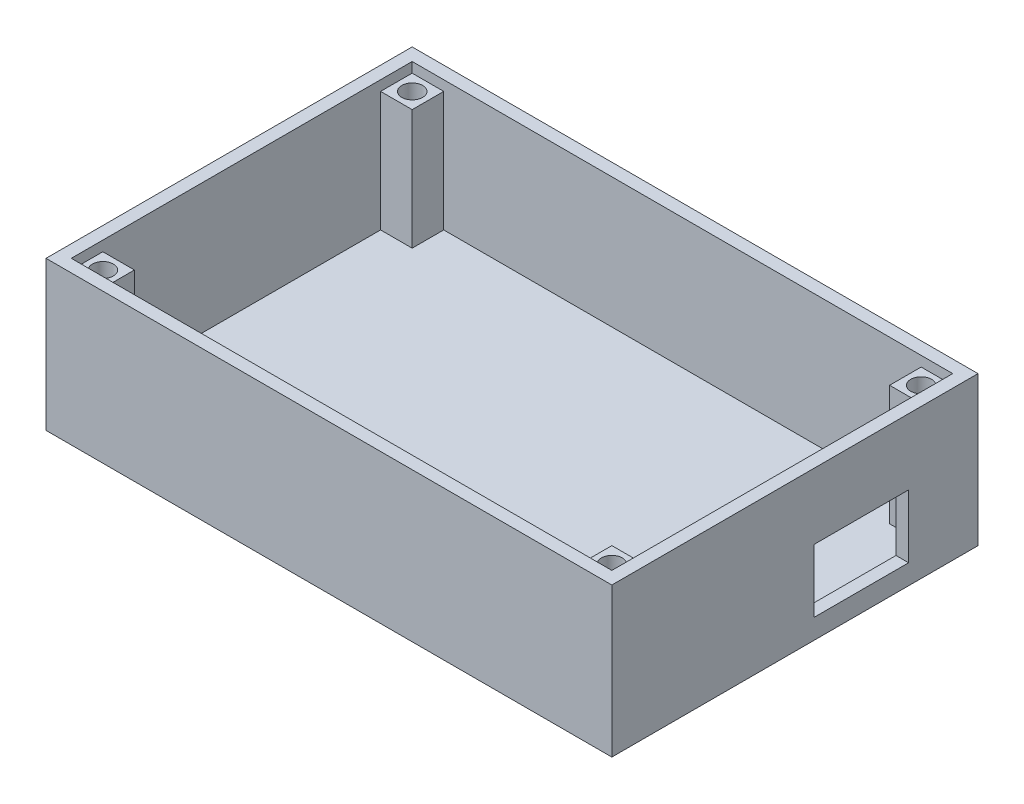
ISO-10303-21;
HEADER;
FILE_DESCRIPTION(('STEP AP214'),'2;1');
FILE_NAME('part.step','',(''),(''),'','','');
FILE_SCHEMA(('AUTOMOTIVE_DESIGN { 1 0 10303 214 1 1 1 1 }'));
ENDSEC;
DATA;
#1=APPLICATION_CONTEXT('core data for automotive mechanical design processes');
#2=APPLICATION_PROTOCOL_DEFINITION('international standard','automotive_design',2000,#1);
#3=PRODUCT_CONTEXT('',#1,'mechanical');
#4=PRODUCT('Part','Part','',(#3));
#5=PRODUCT_RELATED_PRODUCT_CATEGORY('part','',(#4));
#6=PRODUCT_DEFINITION_FORMATION('','',#4);
#7=PRODUCT_DEFINITION_CONTEXT('part definition',#1,'design');
#8=PRODUCT_DEFINITION('design','',#6,#7);
#9=PRODUCT_DEFINITION_SHAPE('','',#8);
#10=(LENGTH_UNIT() NAMED_UNIT(*) SI_UNIT(.MILLI.,.METRE.));
#11=(NAMED_UNIT(*) PLANE_ANGLE_UNIT() SI_UNIT($,.RADIAN.));
#12=(NAMED_UNIT(*) SI_UNIT($,.STERADIAN.) SOLID_ANGLE_UNIT());
#13=UNCERTAINTY_MEASURE_WITH_UNIT(LENGTH_MEASURE(1.E-05),#10,'distance_accuracy_value','');
#14=(GEOMETRIC_REPRESENTATION_CONTEXT(3) GLOBAL_UNCERTAINTY_ASSIGNED_CONTEXT((#13)) GLOBAL_UNIT_ASSIGNED_CONTEXT((#10,
#11,#12)) REPRESENTATION_CONTEXT('',''));
#15=CARTESIAN_POINT('',(0.,0.,0.));
#16=DIRECTION('',(0.,0.,1.));
#17=DIRECTION('',(1.,0.,0.));
#18=AXIS2_PLACEMENT_3D('',#15,#16,#17);
#19=CARTESIAN_POINT('',(42.8,19.,26.99));
#20=DIRECTION('',(-1.,0.,0.));
#21=DIRECTION('',(0.,0.,1.));
#22=AXIS2_PLACEMENT_3D('',#19,#20,#21);
#23=PLANE('',#22);
#24=DIRECTION('',(0.,0.,-1.));
#25=VECTOR('',#24,1.);
#26=CARTESIAN_POINT('',(42.8,0.,26.99));
#27=LINE('',#26,#25);
#28=CARTESIAN_POINT('',(42.8,0.,26.99));
#29=VERTEX_POINT('',#28);
#30=CARTESIAN_POINT('',(42.8,0.,21.99));
#31=VERTEX_POINT('',#30);
#32=EDGE_CURVE('E112',#29,#31,#27,.T.);
#33=ORIENTED_EDGE('',*,*,#32,.T.);
#34=DIRECTION('',(0.,-1.,0.));
#35=VECTOR('',#34,1.);
#36=CARTESIAN_POINT('',(42.8,19.,21.99));
#37=LINE('',#36,#35);
#38=CARTESIAN_POINT('',(42.8,19.,21.99));
#39=VERTEX_POINT('',#38);
#40=EDGE_CURVE('E12',#39,#31,#37,.T.);
#41=ORIENTED_EDGE('',*,*,#40,.F.);
#42=DIRECTION('',(0.,0.,-1.));
#43=VECTOR('',#42,1.);
#44=CARTESIAN_POINT('',(42.8,19.,26.99));
#45=LINE('',#44,#43);
#46=CARTESIAN_POINT('',(42.8,19.,26.99));
#47=VERTEX_POINT('',#46);
#48=EDGE_CURVE('E100',#47,#39,#45,.T.);
#49=ORIENTED_EDGE('',*,*,#48,.F.);
#50=DIRECTION('',(0.,-1.,0.));
#51=VECTOR('',#50,1.);
#52=CARTESIAN_POINT('',(42.8,19.,26.99));
#53=LINE('',#52,#51);
#54=EDGE_CURVE('E108',#47,#29,#53,.T.);
#55=ORIENTED_EDGE('',*,*,#54,.T.);
#56=EDGE_LOOP('',(#33,#41,#49,#55));
#57=FACE_BOUND('',#56,.T.);
#58=ADVANCED_FACE('F49',(#57),#23,.F.);
#59=CARTESIAN_POINT('',(42.8,19.,21.99));
#60=DIRECTION('',(0.,0.,1.));
#61=DIRECTION('',(1.,0.,0.));
#62=AXIS2_PLACEMENT_3D('',#59,#60,#61);
#63=PLANE('',#62);
#64=DIRECTION('',(-1.,0.,0.));
#65=VECTOR('',#64,1.);
#66=CARTESIAN_POINT('',(42.8,0.,21.99));
#67=LINE('',#66,#65);
#68=CARTESIAN_POINT('',(37.8,0.,21.99));
#69=VERTEX_POINT('',#68);
#70=EDGE_CURVE('E104',#31,#69,#67,.T.);
#71=ORIENTED_EDGE('',*,*,#70,.T.);
#72=DIRECTION('',(0.,-1.,0.));
#73=VECTOR('',#72,1.);
#74=CARTESIAN_POINT('',(37.8,19.,21.99));
#75=LINE('',#74,#73);
#76=CARTESIAN_POINT('',(37.8,19.,21.99));
#77=VERTEX_POINT('',#76);
#78=EDGE_CURVE('E57',#77,#69,#75,.T.);
#79=ORIENTED_EDGE('',*,*,#78,.F.);
#80=DIRECTION('',(-1.,0.,0.));
#81=VECTOR('',#80,1.);
#82=CARTESIAN_POINT('',(42.8,19.,21.99));
#83=LINE('',#82,#81);
#84=EDGE_CURVE('E95',#39,#77,#83,.T.);
#85=ORIENTED_EDGE('',*,*,#84,.F.);
#86=ORIENTED_EDGE('',*,*,#40,.T.);
#87=EDGE_LOOP('',(#71,#79,#85,#86));
#88=FACE_BOUND('',#87,.T.);
#89=ADVANCED_FACE('F103',(#88),#63,.F.);
#90=CARTESIAN_POINT('',(37.8,19.,26.99));
#91=DIRECTION('',(1.,0.,0.));
#92=DIRECTION('',(0.,0.,-1.));
#93=AXIS2_PLACEMENT_3D('',#90,#91,#92);
#94=PLANE('',#93);
#95=DIRECTION('',(0.,0.,1.));
#96=VECTOR('',#95,1.);
#97=CARTESIAN_POINT('',(37.8,0.,26.99));
#98=LINE('',#97,#96);
#99=CARTESIAN_POINT('',(37.8,0.,26.99));
#100=VERTEX_POINT('',#99);
#101=EDGE_CURVE('E82',#69,#100,#98,.T.);
#102=ORIENTED_EDGE('',*,*,#101,.T.);
#103=DIRECTION('',(0.,-1.,0.));
#104=VECTOR('',#103,1.);
#105=CARTESIAN_POINT('',(37.8,19.,26.99));
#106=LINE('',#105,#104);
#107=CARTESIAN_POINT('',(37.8,19.,26.99));
#108=VERTEX_POINT('',#107);
#109=EDGE_CURVE('E105',#108,#100,#106,.T.);
#110=ORIENTED_EDGE('',*,*,#109,.F.);
#111=DIRECTION('',(0.,0.,1.));
#112=VECTOR('',#111,1.);
#113=CARTESIAN_POINT('',(37.8,19.,26.99));
#114=LINE('',#113,#112);
#115=EDGE_CURVE('E98',#77,#108,#114,.T.);
#116=ORIENTED_EDGE('',*,*,#115,.F.);
#117=ORIENTED_EDGE('',*,*,#78,.T.);
#118=EDGE_LOOP('',(#102,#110,#116,#117));
#119=FACE_BOUND('',#118,.T.);
#120=ADVANCED_FACE('F106',(#119),#94,.F.);
#121=CARTESIAN_POINT('',(42.8,19.,26.99));
#122=DIRECTION('',(0.,0.,-1.));
#123=DIRECTION('',(-1.,0.,0.));
#124=AXIS2_PLACEMENT_3D('',#121,#122,#123);
#125=PLANE('',#124);
#126=DIRECTION('',(1.,0.,0.));
#127=VECTOR('',#126,1.);
#128=CARTESIAN_POINT('',(42.8,0.,26.99));
#129=LINE('',#128,#127);
#130=EDGE_CURVE('E88',#100,#29,#129,.T.);
#131=ORIENTED_EDGE('',*,*,#130,.T.);
#132=ORIENTED_EDGE('',*,*,#54,.F.);
#133=DIRECTION('',(1.,0.,0.));
#134=VECTOR('',#133,1.);
#135=CARTESIAN_POINT('',(42.8,19.,26.99));
#136=LINE('',#135,#134);
#137=EDGE_CURVE('E65',#108,#47,#136,.T.);
#138=ORIENTED_EDGE('',*,*,#137,.F.);
#139=ORIENTED_EDGE('',*,*,#109,.T.);
#140=EDGE_LOOP('',(#131,#132,#138,#139));
#141=FACE_BOUND('',#140,.T.);
#142=ADVANCED_FACE('F120',(#141),#125,.F.);
#143=CARTESIAN_POINT('',(0.,19.,0.));
#144=DIRECTION('',(0.,1.,0.));
#145=DIRECTION('',(0.,0.,1.));
#146=AXIS2_PLACEMENT_3D('',#143,#144,#145);
#147=PLANE('',#146);
#148=CARTESIAN_POINT('',(40.29900386,19.,24.49509047));
#149=DIRECTION('',(0.,1.,0.));
#150=DIRECTION('',(0.,0.,1.));
#151=AXIS2_PLACEMENT_3D('',#148,#149,#150);
#152=CIRCLE('',#151,1.65);
#153=CARTESIAN_POINT('',(40.29900386,19.,26.14509047));
#154=VERTEX_POINT('',#153);
#155=EDGE_CURVE('E115',#154,#154,#152,.T.);
#156=ORIENTED_EDGE('',*,*,#155,.F.);
#157=EDGE_LOOP('',(#156));
#158=FACE_BOUND('',#157,.T.);
#159=ORIENTED_EDGE('',*,*,#48,.T.);
#160=ORIENTED_EDGE('',*,*,#84,.T.);
#161=ORIENTED_EDGE('',*,*,#115,.T.);
#162=ORIENTED_EDGE('',*,*,#137,.T.);
#163=EDGE_LOOP('',(#159,#160,#161,#162));
#164=FACE_BOUND('',#163,.T.);
#165=ADVANCED_FACE('F96',(#158,#164),#147,.T.);
#166=CARTESIAN_POINT('',(0.,0.,0.));
#167=DIRECTION('',(0.,1.,0.));
#168=DIRECTION('',(0.,0.,1.));
#169=AXIS2_PLACEMENT_3D('',#166,#167,#168);
#170=PLANE('',#169);
#171=ORIENTED_EDGE('',*,*,#32,.F.);
#172=ORIENTED_EDGE('',*,*,#130,.F.);
#173=ORIENTED_EDGE('',*,*,#101,.F.);
#174=ORIENTED_EDGE('',*,*,#70,.F.);
#175=EDGE_LOOP('',(#171,#172,#173,#174));
#176=FACE_BOUND('',#175,.T.);
#177=ADVANCED_FACE('F123',(#176),#170,.F.);
#178=CARTESIAN_POINT('',(40.29900386,15.,24.49509047));
#179=DIRECTION('',(0.,1.,0.));
#180=DIRECTION('',(0.,0.,1.));
#181=AXIS2_PLACEMENT_3D('',#178,#179,#180);
#182=CYLINDRICAL_SURFACE('',#181,1.65);
#183=CARTESIAN_POINT('',(40.29900386,15.,24.49509047));
#184=DIRECTION('',(0.,1.,0.));
#185=DIRECTION('',(0.,0.,1.));
#186=AXIS2_PLACEMENT_3D('',#183,#184,#185);
#187=CIRCLE('',#186,1.65);
#188=CARTESIAN_POINT('',(40.29900386,15.,26.14509047));
#189=VERTEX_POINT('',#188);
#190=EDGE_CURVE('E126',#189,#189,#187,.T.);
#191=ORIENTED_EDGE('',*,*,#190,.F.);
#192=EDGE_LOOP('',(#191));
#193=FACE_BOUND('',#192,.T.);
#194=ORIENTED_EDGE('',*,*,#155,.T.);
#195=EDGE_LOOP('',(#194));
#196=FACE_BOUND('',#195,.T.);
#197=ADVANCED_FACE('F132',(#193,#196),#182,.F.);
#198=CARTESIAN_POINT('',(40.29900386,15.,24.49509047));
#199=DIRECTION('',(0.,1.,0.));
#200=DIRECTION('',(0.,0.,1.));
#201=AXIS2_PLACEMENT_3D('',#198,#199,#200);
#202=PLANE('',#201);
#203=ORIENTED_EDGE('',*,*,#190,.T.);
#204=EDGE_LOOP('',(#203));
#205=FACE_BOUND('',#204,.T.);
#206=ADVANCED_FACE('F176',(#205),#202,.T.);
#207=CLOSED_SHELL('',(#58,#89,#120,#142,#165,#177,#197,#206));
#208=MANIFOLD_SOLID_BREP('B2',#207);
#209=CARTESIAN_POINT('',(-42.8,19.,26.99));
#210=DIRECTION('',(1.,0.,0.));
#211=DIRECTION('',(0.,0.,-1.));
#212=AXIS2_PLACEMENT_3D('',#209,#210,#211);
#213=PLANE('',#212);
#214=DIRECTION('',(0.,0.,1.));
#215=VECTOR('',#214,1.);
#216=CARTESIAN_POINT('',(-42.8,0.,26.99));
#217=LINE('',#216,#215);
#218=CARTESIAN_POINT('',(-42.8,0.,21.99));
#219=VERTEX_POINT('',#218);
#220=CARTESIAN_POINT('',(-42.8,0.,26.99));
#221=VERTEX_POINT('',#220);
#222=EDGE_CURVE('E275',#219,#221,#217,.T.);
#223=ORIENTED_EDGE('',*,*,#222,.T.);
#224=DIRECTION('',(0.,-1.,0.));
#225=VECTOR('',#224,1.);
#226=CARTESIAN_POINT('',(-42.8,19.,26.99));
#227=LINE('',#226,#225);
#228=CARTESIAN_POINT('',(-42.8,19.,26.99));
#229=VERTEX_POINT('',#228);
#230=EDGE_CURVE('E47',#229,#221,#227,.T.);
#231=ORIENTED_EDGE('',*,*,#230,.F.);
#232=DIRECTION('',(0.,0.,1.));
#233=VECTOR('',#232,1.);
#234=CARTESIAN_POINT('',(-42.8,19.,26.99));
#235=LINE('',#234,#233);
#236=CARTESIAN_POINT('',(-42.8,19.,21.99));
#237=VERTEX_POINT('',#236);
#238=EDGE_CURVE('E263',#237,#229,#235,.T.);
#239=ORIENTED_EDGE('',*,*,#238,.F.);
#240=DIRECTION('',(0.,-1.,0.));
#241=VECTOR('',#240,1.);
#242=CARTESIAN_POINT('',(-42.8,19.,21.99));
#243=LINE('',#242,#241);
#244=EDGE_CURVE('E271',#237,#219,#243,.T.);
#245=ORIENTED_EDGE('',*,*,#244,.T.);
#246=EDGE_LOOP('',(#223,#231,#239,#245));
#247=FACE_BOUND('',#246,.T.);
#248=ADVANCED_FACE('F212',(#247),#213,.F.);
#249=CARTESIAN_POINT('',(-42.8,19.,26.99));
#250=DIRECTION('',(0.,0.,-1.));
#251=DIRECTION('',(-1.,0.,0.));
#252=AXIS2_PLACEMENT_3D('',#249,#250,#251);
#253=PLANE('',#252);
#254=DIRECTION('',(1.,0.,0.));
#255=VECTOR('',#254,1.);
#256=CARTESIAN_POINT('',(-42.8,0.,26.99));
#257=LINE('',#256,#255);
#258=CARTESIAN_POINT('',(-37.8,0.,26.99));
#259=VERTEX_POINT('',#258);
#260=EDGE_CURVE('E267',#221,#259,#257,.T.);
#261=ORIENTED_EDGE('',*,*,#260,.T.);
#262=DIRECTION('',(0.,-1.,0.));
#263=VECTOR('',#262,1.);
#264=CARTESIAN_POINT('',(-37.8,19.,26.99));
#265=LINE('',#264,#263);
#266=CARTESIAN_POINT('',(-37.8,19.,26.99));
#267=VERTEX_POINT('',#266);
#268=EDGE_CURVE('E220',#267,#259,#265,.T.);
#269=ORIENTED_EDGE('',*,*,#268,.F.);
#270=DIRECTION('',(1.,0.,0.));
#271=VECTOR('',#270,1.);
#272=CARTESIAN_POINT('',(-42.8,19.,26.99));
#273=LINE('',#272,#271);
#274=EDGE_CURVE('E258',#229,#267,#273,.T.);
#275=ORIENTED_EDGE('',*,*,#274,.F.);
#276=ORIENTED_EDGE('',*,*,#230,.T.);
#277=EDGE_LOOP('',(#261,#269,#275,#276));
#278=FACE_BOUND('',#277,.T.);
#279=ADVANCED_FACE('F266',(#278),#253,.F.);
#280=CARTESIAN_POINT('',(-37.8,19.,26.99));
#281=DIRECTION('',(-1.,0.,0.));
#282=DIRECTION('',(0.,0.,1.));
#283=AXIS2_PLACEMENT_3D('',#280,#281,#282);
#284=PLANE('',#283);
#285=DIRECTION('',(0.,0.,-1.));
#286=VECTOR('',#285,1.);
#287=CARTESIAN_POINT('',(-37.8,0.,26.99));
#288=LINE('',#287,#286);
#289=CARTESIAN_POINT('',(-37.8,0.,21.99));
#290=VERTEX_POINT('',#289);
#291=EDGE_CURVE('E245',#259,#290,#288,.T.);
#292=ORIENTED_EDGE('',*,*,#291,.T.);
#293=DIRECTION('',(0.,-1.,0.));
#294=VECTOR('',#293,1.);
#295=CARTESIAN_POINT('',(-37.8,19.,21.99));
#296=LINE('',#295,#294);
#297=CARTESIAN_POINT('',(-37.8,19.,21.99));
#298=VERTEX_POINT('',#297);
#299=EDGE_CURVE('E268',#298,#290,#296,.T.);
#300=ORIENTED_EDGE('',*,*,#299,.F.);
#301=DIRECTION('',(0.,0.,-1.));
#302=VECTOR('',#301,1.);
#303=CARTESIAN_POINT('',(-37.8,19.,26.99));
#304=LINE('',#303,#302);
#305=EDGE_CURVE('E261',#267,#298,#304,.T.);
#306=ORIENTED_EDGE('',*,*,#305,.F.);
#307=ORIENTED_EDGE('',*,*,#268,.T.);
#308=EDGE_LOOP('',(#292,#300,#306,#307));
#309=FACE_BOUND('',#308,.T.);
#310=ADVANCED_FACE('F269',(#309),#284,.F.);
#311=CARTESIAN_POINT('',(-42.8,19.,21.99));
#312=DIRECTION('',(0.,0.,1.));
#313=DIRECTION('',(1.,0.,0.));
#314=AXIS2_PLACEMENT_3D('',#311,#312,#313);
#315=PLANE('',#314);
#316=DIRECTION('',(-1.,0.,0.));
#317=VECTOR('',#316,1.);
#318=CARTESIAN_POINT('',(-42.8,0.,21.99));
#319=LINE('',#318,#317);
#320=EDGE_CURVE('E251',#290,#219,#319,.T.);
#321=ORIENTED_EDGE('',*,*,#320,.T.);
#322=ORIENTED_EDGE('',*,*,#244,.F.);
#323=DIRECTION('',(-1.,0.,0.));
#324=VECTOR('',#323,1.);
#325=CARTESIAN_POINT('',(-42.8,19.,21.99));
#326=LINE('',#325,#324);
#327=EDGE_CURVE('E228',#298,#237,#326,.T.);
#328=ORIENTED_EDGE('',*,*,#327,.F.);
#329=ORIENTED_EDGE('',*,*,#299,.T.);
#330=EDGE_LOOP('',(#321,#322,#328,#329));
#331=FACE_BOUND('',#330,.T.);
#332=ADVANCED_FACE('F283',(#331),#315,.F.);
#333=CARTESIAN_POINT('',(0.,19.,0.));
#334=DIRECTION('',(0.,-1.,0.));
#335=DIRECTION('',(0.,0.,-1.));
#336=AXIS2_PLACEMENT_3D('',#333,#334,#335);
#337=PLANE('',#336);
#338=CARTESIAN_POINT('',(-40.2908036,19.,24.49509047));
#339=DIRECTION('',(0.,1.,0.));
#340=DIRECTION('',(0.,0.,1.));
#341=AXIS2_PLACEMENT_3D('',#338,#339,#340);
#342=CIRCLE('',#341,1.65);
#343=CARTESIAN_POINT('',(-40.2908036,19.,26.14509047));
#344=VERTEX_POINT('',#343);
#345=EDGE_CURVE('E289',#344,#344,#342,.T.);
#346=ORIENTED_EDGE('',*,*,#345,.F.);
#347=EDGE_LOOP('',(#346));
#348=FACE_BOUND('',#347,.T.);
#349=ORIENTED_EDGE('',*,*,#238,.T.);
#350=ORIENTED_EDGE('',*,*,#274,.T.);
#351=ORIENTED_EDGE('',*,*,#305,.T.);
#352=ORIENTED_EDGE('',*,*,#327,.T.);
#353=EDGE_LOOP('',(#349,#350,#351,#352));
#354=FACE_BOUND('',#353,.T.);
#355=ADVANCED_FACE('F259',(#348,#354),#337,.F.);
#356=CARTESIAN_POINT('',(0.,0.,0.));
#357=DIRECTION('',(0.,-1.,0.));
#358=DIRECTION('',(0.,0.,-1.));
#359=AXIS2_PLACEMENT_3D('',#356,#357,#358);
#360=PLANE('',#359);
#361=ORIENTED_EDGE('',*,*,#222,.F.);
#362=ORIENTED_EDGE('',*,*,#320,.F.);
#363=ORIENTED_EDGE('',*,*,#291,.F.);
#364=ORIENTED_EDGE('',*,*,#260,.F.);
#365=EDGE_LOOP('',(#361,#362,#363,#364));
#366=FACE_BOUND('',#365,.T.);
#367=ADVANCED_FACE('F286',(#366),#360,.T.);
#368=CARTESIAN_POINT('',(-40.2908036,15.,24.49509047));
#369=DIRECTION('',(0.,1.,0.));
#370=DIRECTION('',(0.,0.,1.));
#371=AXIS2_PLACEMENT_3D('',#368,#369,#370);
#372=CYLINDRICAL_SURFACE('',#371,1.65);
#373=CARTESIAN_POINT('',(-40.2908036,15.,24.49509047));
#374=DIRECTION('',(0.,1.,0.));
#375=DIRECTION('',(0.,0.,1.));
#376=AXIS2_PLACEMENT_3D('',#373,#374,#375);
#377=CIRCLE('',#376,1.65);
#378=CARTESIAN_POINT('',(-40.2908036,15.,26.14509047));
#379=VERTEX_POINT('',#378);
#380=EDGE_CURVE('E278',#379,#379,#377,.T.);
#381=ORIENTED_EDGE('',*,*,#380,.F.);
#382=EDGE_LOOP('',(#381));
#383=FACE_BOUND('',#382,.T.);
#384=ORIENTED_EDGE('',*,*,#345,.T.);
#385=EDGE_LOOP('',(#384));
#386=FACE_BOUND('',#385,.T.);
#387=ADVANCED_FACE('F297',(#383,#386),#372,.F.);
#388=CARTESIAN_POINT('',(-40.2908036,15.,24.49509047));
#389=DIRECTION('',(0.,1.,0.));
#390=DIRECTION('',(0.,0.,1.));
#391=AXIS2_PLACEMENT_3D('',#388,#389,#390);
#392=PLANE('',#391);
#393=ORIENTED_EDGE('',*,*,#380,.T.);
#394=EDGE_LOOP('',(#393));
#395=FACE_BOUND('',#394,.T.);
#396=ADVANCED_FACE('F295',(#395),#392,.T.);
#397=CLOSED_SHELL('',(#248,#279,#310,#332,#355,#367,#387,#396));
#398=MANIFOLD_SOLID_BREP('B6',#397);
#399=CARTESIAN_POINT('',(-42.8,19.,-26.99));
#400=DIRECTION('',(1.,0.,0.));
#401=DIRECTION('',(0.,0.,-1.));
#402=AXIS2_PLACEMENT_3D('',#399,#400,#401);
#403=PLANE('',#402);
#404=DIRECTION('',(0.,0.,1.));
#405=VECTOR('',#404,1.);
#406=CARTESIAN_POINT('',(-42.8,0.,-26.99));
#407=LINE('',#406,#405);
#408=CARTESIAN_POINT('',(-42.8,0.,-26.99));
#409=VERTEX_POINT('',#408);
#410=CARTESIAN_POINT('',(-42.8,0.,-21.99));
#411=VERTEX_POINT('',#410);
#412=EDGE_CURVE('E438',#409,#411,#407,.T.);
#413=ORIENTED_EDGE('',*,*,#412,.T.);
#414=DIRECTION('',(0.,-1.,0.));
#415=VECTOR('',#414,1.);
#416=CARTESIAN_POINT('',(-42.8,19.,-21.99));
#417=LINE('',#416,#415);
#418=CARTESIAN_POINT('',(-42.8,19.,-21.99));
#419=VERTEX_POINT('',#418);
#420=EDGE_CURVE('E210',#419,#411,#417,.T.);
#421=ORIENTED_EDGE('',*,*,#420,.F.);
#422=DIRECTION('',(0.,0.,1.));
#423=VECTOR('',#422,1.);
#424=CARTESIAN_POINT('',(-42.8,19.,-26.99));
#425=LINE('',#424,#423);
#426=CARTESIAN_POINT('',(-42.8,19.,-26.99));
#427=VERTEX_POINT('',#426);
#428=EDGE_CURVE('E426',#427,#419,#425,.T.);
#429=ORIENTED_EDGE('',*,*,#428,.F.);
#430=DIRECTION('',(0.,-1.,0.));
#431=VECTOR('',#430,1.);
#432=CARTESIAN_POINT('',(-42.8,19.,-26.99));
#433=LINE('',#432,#431);
#434=EDGE_CURVE('E434',#427,#409,#433,.T.);
#435=ORIENTED_EDGE('',*,*,#434,.T.);
#436=EDGE_LOOP('',(#413,#421,#429,#435));
#437=FACE_BOUND('',#436,.T.);
#438=ADVANCED_FACE('F375',(#437),#403,.F.);
#439=CARTESIAN_POINT('',(-42.8,19.,-21.99));
#440=DIRECTION('',(0.,0.,-1.));
#441=DIRECTION('',(-1.,0.,0.));
#442=AXIS2_PLACEMENT_3D('',#439,#440,#441);
#443=PLANE('',#442);
#444=DIRECTION('',(1.,0.,0.));
#445=VECTOR('',#444,1.);
#446=CARTESIAN_POINT('',(-42.8,0.,-21.99));
#447=LINE('',#446,#445);
#448=CARTESIAN_POINT('',(-37.8,0.,-21.99));
#449=VERTEX_POINT('',#448);
#450=EDGE_CURVE('E430',#411,#449,#447,.T.);
#451=ORIENTED_EDGE('',*,*,#450,.T.);
#452=DIRECTION('',(0.,-1.,0.));
#453=VECTOR('',#452,1.);
#454=CARTESIAN_POINT('',(-37.8,19.,-21.99));
#455=LINE('',#454,#453);
#456=CARTESIAN_POINT('',(-37.8,19.,-21.99));
#457=VERTEX_POINT('',#456);
#458=EDGE_CURVE('E383',#457,#449,#455,.T.);
#459=ORIENTED_EDGE('',*,*,#458,.F.);
#460=DIRECTION('',(1.,0.,0.));
#461=VECTOR('',#460,1.);
#462=CARTESIAN_POINT('',(-42.8,19.,-21.99));
#463=LINE('',#462,#461);
#464=EDGE_CURVE('E421',#419,#457,#463,.T.);
#465=ORIENTED_EDGE('',*,*,#464,.F.);
#466=ORIENTED_EDGE('',*,*,#420,.T.);
#467=EDGE_LOOP('',(#451,#459,#465,#466));
#468=FACE_BOUND('',#467,.T.);
#469=ADVANCED_FACE('F429',(#468),#443,.F.);
#470=CARTESIAN_POINT('',(-37.8,19.,-26.99));
#471=DIRECTION('',(-1.,0.,0.));
#472=DIRECTION('',(0.,0.,1.));
#473=AXIS2_PLACEMENT_3D('',#470,#471,#472);
#474=PLANE('',#473);
#475=DIRECTION('',(0.,0.,-1.));
#476=VECTOR('',#475,1.);
#477=CARTESIAN_POINT('',(-37.8,0.,-26.99));
#478=LINE('',#477,#476);
#479=CARTESIAN_POINT('',(-37.8,0.,-26.99));
#480=VERTEX_POINT('',#479);
#481=EDGE_CURVE('E408',#449,#480,#478,.T.);
#482=ORIENTED_EDGE('',*,*,#481,.T.);
#483=DIRECTION('',(0.,-1.,0.));
#484=VECTOR('',#483,1.);
#485=CARTESIAN_POINT('',(-37.8,19.,-26.99));
#486=LINE('',#485,#484);
#487=CARTESIAN_POINT('',(-37.8,19.,-26.99));
#488=VERTEX_POINT('',#487);
#489=EDGE_CURVE('E431',#488,#480,#486,.T.);
#490=ORIENTED_EDGE('',*,*,#489,.F.);
#491=DIRECTION('',(0.,0.,-1.));
#492=VECTOR('',#491,1.);
#493=CARTESIAN_POINT('',(-37.8,19.,-26.99));
#494=LINE('',#493,#492);
#495=EDGE_CURVE('E424',#457,#488,#494,.T.);
#496=ORIENTED_EDGE('',*,*,#495,.F.);
#497=ORIENTED_EDGE('',*,*,#458,.T.);
#498=EDGE_LOOP('',(#482,#490,#496,#497));
#499=FACE_BOUND('',#498,.T.);
#500=ADVANCED_FACE('F432',(#499),#474,.F.);
#501=CARTESIAN_POINT('',(-42.8,19.,-26.99));
#502=DIRECTION('',(0.,0.,1.));
#503=DIRECTION('',(1.,0.,0.));
#504=AXIS2_PLACEMENT_3D('',#501,#502,#503);
#505=PLANE('',#504);
#506=DIRECTION('',(-1.,0.,0.));
#507=VECTOR('',#506,1.);
#508=CARTESIAN_POINT('',(-42.8,0.,-26.99));
#509=LINE('',#508,#507);
#510=EDGE_CURVE('E414',#480,#409,#509,.T.);
#511=ORIENTED_EDGE('',*,*,#510,.T.);
#512=ORIENTED_EDGE('',*,*,#434,.F.);
#513=DIRECTION('',(-1.,0.,0.));
#514=VECTOR('',#513,1.);
#515=CARTESIAN_POINT('',(-42.8,19.,-26.99));
#516=LINE('',#515,#514);
#517=EDGE_CURVE('E391',#488,#427,#516,.T.);
#518=ORIENTED_EDGE('',*,*,#517,.F.);
#519=ORIENTED_EDGE('',*,*,#489,.T.);
#520=EDGE_LOOP('',(#511,#512,#518,#519));
#521=FACE_BOUND('',#520,.T.);
#522=ADVANCED_FACE('F446',(#521),#505,.F.);
#523=CARTESIAN_POINT('',(0.,19.,0.));
#524=DIRECTION('',(0.,1.,0.));
#525=DIRECTION('',(0.,0.,1.));
#526=AXIS2_PLACEMENT_3D('',#523,#524,#525);
#527=PLANE('',#526);
#528=CARTESIAN_POINT('',(-40.2908036,19.,-24.48916763));
#529=DIRECTION('',(0.,1.,0.));
#530=DIRECTION('',(0.,0.,1.));
#531=AXIS2_PLACEMENT_3D('',#528,#529,#530);
#532=CIRCLE('',#531,1.65);
#533=CARTESIAN_POINT('',(-40.2908036,19.,-22.83916763));
#534=VERTEX_POINT('',#533);
#535=EDGE_CURVE('E441',#534,#534,#532,.T.);
#536=ORIENTED_EDGE('',*,*,#535,.F.);
#537=EDGE_LOOP('',(#536));
#538=FACE_BOUND('',#537,.T.);
#539=ORIENTED_EDGE('',*,*,#428,.T.);
#540=ORIENTED_EDGE('',*,*,#464,.T.);
#541=ORIENTED_EDGE('',*,*,#495,.T.);
#542=ORIENTED_EDGE('',*,*,#517,.T.);
#543=EDGE_LOOP('',(#539,#540,#541,#542));
#544=FACE_BOUND('',#543,.T.);
#545=ADVANCED_FACE('F422',(#538,#544),#527,.T.);
#546=CARTESIAN_POINT('',(0.,0.,0.));
#547=DIRECTION('',(0.,1.,0.));
#548=DIRECTION('',(0.,0.,1.));
#549=AXIS2_PLACEMENT_3D('',#546,#547,#548);
#550=PLANE('',#549);
#551=ORIENTED_EDGE('',*,*,#412,.F.);
#552=ORIENTED_EDGE('',*,*,#510,.F.);
#553=ORIENTED_EDGE('',*,*,#481,.F.);
#554=ORIENTED_EDGE('',*,*,#450,.F.);
#555=EDGE_LOOP('',(#551,#552,#553,#554));
#556=FACE_BOUND('',#555,.T.);
#557=ADVANCED_FACE('F449',(#556),#550,.F.);
#558=CARTESIAN_POINT('',(-40.2908036,15.,-24.48916763));
#559=DIRECTION('',(0.,1.,0.));
#560=DIRECTION('',(0.,0.,1.));
#561=AXIS2_PLACEMENT_3D('',#558,#559,#560);
#562=CYLINDRICAL_SURFACE('',#561,1.65);
#563=CARTESIAN_POINT('',(-40.2908036,15.,-24.48916763));
#564=DIRECTION('',(0.,1.,0.));
#565=DIRECTION('',(0.,0.,1.));
#566=AXIS2_PLACEMENT_3D('',#563,#564,#565);
#567=CIRCLE('',#566,1.65);
#568=CARTESIAN_POINT('',(-40.2908036,15.,-22.83916763));
#569=VERTEX_POINT('',#568);
#570=EDGE_CURVE('E452',#569,#569,#567,.T.);
#571=ORIENTED_EDGE('',*,*,#570,.F.);
#572=EDGE_LOOP('',(#571));
#573=FACE_BOUND('',#572,.T.);
#574=ORIENTED_EDGE('',*,*,#535,.T.);
#575=EDGE_LOOP('',(#574));
#576=FACE_BOUND('',#575,.T.);
#577=ADVANCED_FACE('F458',(#573,#576),#562,.F.);
#578=CARTESIAN_POINT('',(-40.2908036,15.,-24.48916763));
#579=DIRECTION('',(0.,1.,0.));
#580=DIRECTION('',(0.,0.,1.));
#581=AXIS2_PLACEMENT_3D('',#578,#579,#580);
#582=PLANE('',#581);
#583=ORIENTED_EDGE('',*,*,#570,.T.);
#584=EDGE_LOOP('',(#583));
#585=FACE_BOUND('',#584,.T.);
#586=ADVANCED_FACE('F502',(#585),#582,.T.);
#587=CLOSED_SHELL('',(#438,#469,#500,#522,#545,#557,#577,#586));
#588=MANIFOLD_SOLID_BREP('B41',#587);
#589=CARTESIAN_POINT('',(42.8,19.,-26.99));
#590=DIRECTION('',(-1.,0.,0.));
#591=DIRECTION('',(0.,0.,1.));
#592=AXIS2_PLACEMENT_3D('',#589,#590,#591);
#593=PLANE('',#592);
#594=DIRECTION('',(0.,0.,-1.));
#595=VECTOR('',#594,1.);
#596=CARTESIAN_POINT('',(42.8,0.,-26.99));
#597=LINE('',#596,#595);
#598=CARTESIAN_POINT('',(42.8,0.,-21.99));
#599=VERTEX_POINT('',#598);
#600=CARTESIAN_POINT('',(42.8,0.,-26.99));
#601=VERTEX_POINT('',#600);
#602=EDGE_CURVE('E600',#599,#601,#597,.T.);
#603=ORIENTED_EDGE('',*,*,#602,.T.);
#604=DIRECTION('',(0.,-1.,0.));
#605=VECTOR('',#604,1.);
#606=CARTESIAN_POINT('',(42.8,19.,-26.99));
#607=LINE('',#606,#605);
#608=CARTESIAN_POINT('',(42.8,19.,-26.99));
#609=VERTEX_POINT('',#608);
#610=EDGE_CURVE('E373',#609,#601,#607,.T.);
#611=ORIENTED_EDGE('',*,*,#610,.F.);
#612=DIRECTION('',(0.,0.,-1.));
#613=VECTOR('',#612,1.);
#614=CARTESIAN_POINT('',(42.8,19.,-26.99));
#615=LINE('',#614,#613);
#616=CARTESIAN_POINT('',(42.8,19.,-21.99));
#617=VERTEX_POINT('',#616);
#618=EDGE_CURVE('E588',#617,#609,#615,.T.);
#619=ORIENTED_EDGE('',*,*,#618,.F.);
#620=DIRECTION('',(0.,-1.,0.));
#621=VECTOR('',#620,1.);
#622=CARTESIAN_POINT('',(42.8,19.,-21.99));
#623=LINE('',#622,#621);
#624=EDGE_CURVE('E596',#617,#599,#623,.T.);
#625=ORIENTED_EDGE('',*,*,#624,.T.);
#626=EDGE_LOOP('',(#603,#611,#619,#625));
#627=FACE_BOUND('',#626,.T.);
#628=ADVANCED_FACE('F537',(#627),#593,.F.);
#629=CARTESIAN_POINT('',(42.8,19.,-26.99));
#630=DIRECTION('',(0.,0.,1.));
#631=DIRECTION('',(1.,0.,0.));
#632=AXIS2_PLACEMENT_3D('',#629,#630,#631);
#633=PLANE('',#632);
#634=DIRECTION('',(-1.,0.,0.));
#635=VECTOR('',#634,1.);
#636=CARTESIAN_POINT('',(42.8,0.,-26.99));
#637=LINE('',#636,#635);
#638=CARTESIAN_POINT('',(37.8,0.,-26.99));
#639=VERTEX_POINT('',#638);
#640=EDGE_CURVE('E592',#601,#639,#637,.T.);
#641=ORIENTED_EDGE('',*,*,#640,.T.);
#642=DIRECTION('',(0.,-1.,0.));
#643=VECTOR('',#642,1.);
#644=CARTESIAN_POINT('',(37.8,19.,-26.99));
#645=LINE('',#644,#643);
#646=CARTESIAN_POINT('',(37.8,19.,-26.99));
#647=VERTEX_POINT('',#646);
#648=EDGE_CURVE('E545',#647,#639,#645,.T.);
#649=ORIENTED_EDGE('',*,*,#648,.F.);
#650=DIRECTION('',(-1.,0.,0.));
#651=VECTOR('',#650,1.);
#652=CARTESIAN_POINT('',(42.8,19.,-26.99));
#653=LINE('',#652,#651);
#654=EDGE_CURVE('E583',#609,#647,#653,.T.);
#655=ORIENTED_EDGE('',*,*,#654,.F.);
#656=ORIENTED_EDGE('',*,*,#610,.T.);
#657=EDGE_LOOP('',(#641,#649,#655,#656));
#658=FACE_BOUND('',#657,.T.);
#659=ADVANCED_FACE('F591',(#658),#633,.F.);
#660=CARTESIAN_POINT('',(37.8,19.,-26.99));
#661=DIRECTION('',(1.,0.,0.));
#662=DIRECTION('',(0.,0.,-1.));
#663=AXIS2_PLACEMENT_3D('',#660,#661,#662);
#664=PLANE('',#663);
#665=DIRECTION('',(0.,0.,1.));
#666=VECTOR('',#665,1.);
#667=CARTESIAN_POINT('',(37.8,0.,-26.99));
#668=LINE('',#667,#666);
#669=CARTESIAN_POINT('',(37.8,0.,-21.99));
#670=VERTEX_POINT('',#669);
#671=EDGE_CURVE('E570',#639,#670,#668,.T.);
#672=ORIENTED_EDGE('',*,*,#671,.T.);
#673=DIRECTION('',(0.,-1.,0.));
#674=VECTOR('',#673,1.);
#675=CARTESIAN_POINT('',(37.8,19.,-21.99));
#676=LINE('',#675,#674);
#677=CARTESIAN_POINT('',(37.8,19.,-21.99));
#678=VERTEX_POINT('',#677);
#679=EDGE_CURVE('E593',#678,#670,#676,.T.);
#680=ORIENTED_EDGE('',*,*,#679,.F.);
#681=DIRECTION('',(0.,0.,1.));
#682=VECTOR('',#681,1.);
#683=CARTESIAN_POINT('',(37.8,19.,-26.99));
#684=LINE('',#683,#682);
#685=EDGE_CURVE('E586',#647,#678,#684,.T.);
#686=ORIENTED_EDGE('',*,*,#685,.F.);
#687=ORIENTED_EDGE('',*,*,#648,.T.);
#688=EDGE_LOOP('',(#672,#680,#686,#687));
#689=FACE_BOUND('',#688,.T.);
#690=ADVANCED_FACE('F594',(#689),#664,.F.);
#691=CARTESIAN_POINT('',(42.8,19.,-21.99));
#692=DIRECTION('',(0.,0.,-1.));
#693=DIRECTION('',(-1.,0.,0.));
#694=AXIS2_PLACEMENT_3D('',#691,#692,#693);
#695=PLANE('',#694);
#696=DIRECTION('',(1.,0.,0.));
#697=VECTOR('',#696,1.);
#698=CARTESIAN_POINT('',(42.8,0.,-21.99));
#699=LINE('',#698,#697);
#700=EDGE_CURVE('E576',#670,#599,#699,.T.);
#701=ORIENTED_EDGE('',*,*,#700,.T.);
#702=ORIENTED_EDGE('',*,*,#624,.F.);
#703=DIRECTION('',(1.,0.,0.));
#704=VECTOR('',#703,1.);
#705=CARTESIAN_POINT('',(42.8,19.,-21.99));
#706=LINE('',#705,#704);
#707=EDGE_CURVE('E553',#678,#617,#706,.T.);
#708=ORIENTED_EDGE('',*,*,#707,.F.);
#709=ORIENTED_EDGE('',*,*,#679,.T.);
#710=EDGE_LOOP('',(#701,#702,#708,#709));
#711=FACE_BOUND('',#710,.T.);
#712=ADVANCED_FACE('F608',(#711),#695,.F.);
#713=CARTESIAN_POINT('',(0.,19.,0.));
#714=DIRECTION('',(0.,-1.,0.));
#715=DIRECTION('',(0.,0.,-1.));
#716=AXIS2_PLACEMENT_3D('',#713,#714,#715);
#717=PLANE('',#716);
#718=CARTESIAN_POINT('',(40.29900386,19.,-24.49016763));
#719=DIRECTION('',(0.,1.,0.));
#720=DIRECTION('',(0.,0.,1.));
#721=AXIS2_PLACEMENT_3D('',#718,#719,#720);
#722=CIRCLE('',#721,1.65);
#723=CARTESIAN_POINT('',(40.29900386,19.,-22.84016763));
#724=VERTEX_POINT('',#723);
#725=EDGE_CURVE('E603',#724,#724,#722,.T.);
#726=ORIENTED_EDGE('',*,*,#725,.F.);
#727=EDGE_LOOP('',(#726));
#728=FACE_BOUND('',#727,.T.);
#729=ORIENTED_EDGE('',*,*,#618,.T.);
#730=ORIENTED_EDGE('',*,*,#654,.T.);
#731=ORIENTED_EDGE('',*,*,#685,.T.);
#732=ORIENTED_EDGE('',*,*,#707,.T.);
#733=EDGE_LOOP('',(#729,#730,#731,#732));
#734=FACE_BOUND('',#733,.T.);
#735=ADVANCED_FACE('F584',(#728,#734),#717,.F.);
#736=CARTESIAN_POINT('',(0.,0.,0.));
#737=DIRECTION('',(0.,-1.,0.));
#738=DIRECTION('',(0.,0.,-1.));
#739=AXIS2_PLACEMENT_3D('',#736,#737,#738);
#740=PLANE('',#739);
#741=ORIENTED_EDGE('',*,*,#602,.F.);
#742=ORIENTED_EDGE('',*,*,#700,.F.);
#743=ORIENTED_EDGE('',*,*,#671,.F.);
#744=ORIENTED_EDGE('',*,*,#640,.F.);
#745=EDGE_LOOP('',(#741,#742,#743,#744));
#746=FACE_BOUND('',#745,.T.);
#747=ADVANCED_FACE('F611',(#746),#740,.T.);
#748=CARTESIAN_POINT('',(40.29900386,15.,-24.49016763));
#749=DIRECTION('',(0.,1.,0.));
#750=DIRECTION('',(0.,0.,1.));
#751=AXIS2_PLACEMENT_3D('',#748,#749,#750);
#752=CYLINDRICAL_SURFACE('',#751,1.65);
#753=CARTESIAN_POINT('',(40.29900386,15.,-24.49016763));
#754=DIRECTION('',(0.,1.,0.));
#755=DIRECTION('',(0.,0.,1.));
#756=AXIS2_PLACEMENT_3D('',#753,#754,#755);
#757=CIRCLE('',#756,1.65);
#758=CARTESIAN_POINT('',(40.29900386,15.,-22.84016763));
#759=VERTEX_POINT('',#758);
#760=EDGE_CURVE('E614',#759,#759,#757,.T.);
#761=ORIENTED_EDGE('',*,*,#760,.F.);
#762=EDGE_LOOP('',(#761));
#763=FACE_BOUND('',#762,.T.);
#764=ORIENTED_EDGE('',*,*,#725,.T.);
#765=EDGE_LOOP('',(#764));
#766=FACE_BOUND('',#765,.T.);
#767=ADVANCED_FACE('F620',(#763,#766),#752,.F.);
#768=CARTESIAN_POINT('',(40.29900386,15.,-24.49016763));
#769=DIRECTION('',(0.,1.,0.));
#770=DIRECTION('',(0.,0.,1.));
#771=AXIS2_PLACEMENT_3D('',#768,#769,#770);
#772=PLANE('',#771);
#773=ORIENTED_EDGE('',*,*,#760,.T.);
#774=EDGE_LOOP('',(#773));
#775=FACE_BOUND('',#774,.T.);
#776=ADVANCED_FACE('F664',(#775),#772,.T.);
#777=CLOSED_SHELL('',(#628,#659,#690,#712,#735,#747,#767,#776));
#778=MANIFOLD_SOLID_BREP('B204',#777);
#779=CARTESIAN_POINT('',(0.,20.6,0.));
#780=DIRECTION('',(0.,-1.,0.));
#781=DIRECTION('',(0.,0.,-1.));
#782=AXIS2_PLACEMENT_3D('',#779,#780,#781);
#783=PLANE('',#782);
#784=DIRECTION('',(0.,0.,-1.));
#785=VECTOR('',#784,1.);
#786=CARTESIAN_POINT('',(44.8,20.6,28.99));
#787=LINE('',#786,#785);
#788=CARTESIAN_POINT('',(44.8,20.6,28.99));
#789=VERTEX_POINT('',#788);
#790=CARTESIAN_POINT('',(44.8,20.6,-28.99));
#791=VERTEX_POINT('',#790);
#792=EDGE_CURVE('E849',#789,#791,#787,.T.);
#793=ORIENTED_EDGE('',*,*,#792,.T.);
#794=DIRECTION('',(-1.,0.,0.));
#795=VECTOR('',#794,1.);
#796=CARTESIAN_POINT('',(-44.8,20.6,-28.99));
#797=LINE('',#796,#795);
#798=CARTESIAN_POINT('',(-44.8,20.6,-28.99));
#799=VERTEX_POINT('',#798);
#800=EDGE_CURVE('E852',#791,#799,#797,.T.);
#801=ORIENTED_EDGE('',*,*,#800,.T.);
#802=DIRECTION('',(0.,0.,1.));
#803=VECTOR('',#802,1.);
#804=CARTESIAN_POINT('',(-44.8,20.6,28.99));
#805=LINE('',#804,#803);
#806=CARTESIAN_POINT('',(-44.8,20.6,28.99));
#807=VERTEX_POINT('',#806);
#808=EDGE_CURVE('E854',#799,#807,#805,.T.);
#809=ORIENTED_EDGE('',*,*,#808,.T.);
#810=DIRECTION('',(1.,0.,0.));
#811=VECTOR('',#810,1.);
#812=CARTESIAN_POINT('',(-44.8,20.6,28.99));
#813=LINE('',#812,#811);
#814=EDGE_CURVE('E856',#807,#789,#813,.T.);
#815=ORIENTED_EDGE('',*,*,#814,.T.);
#816=EDGE_LOOP('',(#793,#801,#809,#815));
#817=FACE_BOUND('',#816,.T.);
#818=DIRECTION('',(0.,0.,-1.));
#819=VECTOR('',#818,1.);
#820=CARTESIAN_POINT('',(42.8,20.6,26.99));
#821=LINE('',#820,#819);
#822=CARTESIAN_POINT('',(42.8,20.6,26.99));
#823=VERTEX_POINT('',#822);
#824=CARTESIAN_POINT('',(42.8,20.6,-26.99));
#825=VERTEX_POINT('',#824);
#826=EDGE_CURVE('E818',#823,#825,#821,.T.);
#827=ORIENTED_EDGE('',*,*,#826,.F.);
#828=DIRECTION('',(1.,0.,0.));
#829=VECTOR('',#828,1.);
#830=CARTESIAN_POINT('',(-42.8,20.6,26.99));
#831=LINE('',#830,#829);
#832=CARTESIAN_POINT('',(-42.8,20.6,26.99));
#833=VERTEX_POINT('',#832);
#834=EDGE_CURVE('E826',#833,#823,#831,.T.);
#835=ORIENTED_EDGE('',*,*,#834,.F.);
#836=DIRECTION('',(0.,0.,1.));
#837=VECTOR('',#836,1.);
#838=CARTESIAN_POINT('',(-42.8,20.6,26.99));
#839=LINE('',#838,#837);
#840=CARTESIAN_POINT('',(-42.8,20.6,-26.99));
#841=VERTEX_POINT('',#840);
#842=EDGE_CURVE('E823',#841,#833,#839,.T.);
#843=ORIENTED_EDGE('',*,*,#842,.F.);
#844=DIRECTION('',(-1.,0.,0.));
#845=VECTOR('',#844,1.);
#846=CARTESIAN_POINT('',(-42.8,20.6,-26.99));
#847=LINE('',#846,#845);
#848=EDGE_CURVE('E820',#825,#841,#847,.T.);
#849=ORIENTED_EDGE('',*,*,#848,.F.);
#850=EDGE_LOOP('',(#827,#835,#843,#849));
#851=FACE_BOUND('',#850,.T.);
#852=ADVANCED_FACE('F690',(#817,#851),#783,.F.);
#853=CARTESIAN_POINT('',(44.8,20.6,28.99));
#854=DIRECTION('',(-1.,0.,0.));
#855=DIRECTION('',(0.,0.,1.));
#856=AXIS2_PLACEMENT_3D('',#853,#854,#855);
#857=PLANE('',#856);
#858=DIRECTION('',(0.,0.,-1.));
#859=VECTOR('',#858,1.);
#860=CARTESIAN_POINT('',(44.8,0.151883101794416,-2.99990383990696));
#861=LINE('',#860,#859);
#862=CARTESIAN_POINT('',(44.8,0.151883101794415,-2.99990383990696));
#863=VERTEX_POINT('',#862);
#864=CARTESIAN_POINT('',(44.8,0.151883101794416,-17.999903839907));
#865=VERTEX_POINT('',#864);
#866=EDGE_CURVE('E790',#863,#865,#861,.T.);
#867=ORIENTED_EDGE('',*,*,#866,.F.);
#868=DIRECTION('',(0.,-1.,0.));
#869=VECTOR('',#868,1.);
#870=CARTESIAN_POINT('',(44.8,10.1518831017944,-2.99990383990696));
#871=LINE('',#870,#869);
#872=CARTESIAN_POINT('',(44.8,10.1518831017944,-2.99990383990696));
#873=VERTEX_POINT('',#872);
#874=EDGE_CURVE('E705',#873,#863,#871,.T.);
#875=ORIENTED_EDGE('',*,*,#874,.F.);
#876=DIRECTION('',(0.,0.,1.));
#877=VECTOR('',#876,1.);
#878=CARTESIAN_POINT('',(44.8,10.1518831017944,-2.99990383990696));
#879=LINE('',#878,#877);
#880=CARTESIAN_POINT('',(44.8,10.1518831017944,-17.9999038399069));
#881=VERTEX_POINT('',#880);
#882=EDGE_CURVE('E796',#881,#873,#879,.T.);
#883=ORIENTED_EDGE('',*,*,#882,.F.);
#884=DIRECTION('',(0.,1.,0.));
#885=VECTOR('',#884,1.);
#886=CARTESIAN_POINT('',(44.8,10.1518831017944,-17.9999038399069));
#887=LINE('',#886,#885);
#888=EDGE_CURVE('E781',#865,#881,#887,.T.);
#889=ORIENTED_EDGE('',*,*,#888,.F.);
#890=EDGE_LOOP('',(#867,#875,#883,#889));
#891=FACE_BOUND('',#890,.T.);
#892=DIRECTION('',(0.,-1.,0.));
#893=VECTOR('',#892,1.);
#894=CARTESIAN_POINT('',(44.8,20.6,28.99));
#895=LINE('',#894,#893);
#896=CARTESIAN_POINT('',(44.8,-3.,28.99));
#897=VERTEX_POINT('',#896);
#898=EDGE_CURVE('E858',#789,#897,#895,.T.);
#899=ORIENTED_EDGE('',*,*,#898,.T.);
#900=DIRECTION('',(0.,0.,1.));
#901=VECTOR('',#900,1.);
#902=CARTESIAN_POINT('',(44.8,-3.,-28.99));
#903=LINE('',#902,#901);
#904=CARTESIAN_POINT('',(44.8,-3.,-28.99));
#905=VERTEX_POINT('',#904);
#906=EDGE_CURVE('E803',#905,#897,#903,.T.);
#907=ORIENTED_EDGE('',*,*,#906,.F.);
#908=DIRECTION('',(0.,-1.,0.));
#909=VECTOR('',#908,1.);
#910=CARTESIAN_POINT('',(44.8,20.6,-28.99));
#911=LINE('',#910,#909);
#912=EDGE_CURVE('E864',#791,#905,#911,.T.);
#913=ORIENTED_EDGE('',*,*,#912,.F.);
#914=ORIENTED_EDGE('',*,*,#792,.F.);
#915=EDGE_LOOP('',(#899,#907,#913,#914));
#916=FACE_BOUND('',#915,.T.);
#917=ADVANCED_FACE('F692',(#891,#916),#857,.F.);
#918=CARTESIAN_POINT('',(-44.8,20.6,-28.99));
#919=DIRECTION('',(0.,0.,1.));
#920=DIRECTION('',(1.,0.,0.));
#921=AXIS2_PLACEMENT_3D('',#918,#919,#920);
#922=PLANE('',#921);
#923=ORIENTED_EDGE('',*,*,#912,.T.);
#924=DIRECTION('',(1.,0.,0.));
#925=VECTOR('',#924,1.);
#926=CARTESIAN_POINT('',(-44.8,-3.,-28.99));
#927=LINE('',#926,#925);
#928=CARTESIAN_POINT('',(-44.8,-3.,-28.99));
#929=VERTEX_POINT('',#928);
#930=EDGE_CURVE('E814',#929,#905,#927,.T.);
#931=ORIENTED_EDGE('',*,*,#930,.F.);
#932=DIRECTION('',(0.,-1.,0.));
#933=VECTOR('',#932,1.);
#934=CARTESIAN_POINT('',(-44.8,20.6,-28.99));
#935=LINE('',#934,#933);
#936=EDGE_CURVE('E862',#799,#929,#935,.T.);
#937=ORIENTED_EDGE('',*,*,#936,.F.);
#938=ORIENTED_EDGE('',*,*,#800,.F.);
#939=EDGE_LOOP('',(#923,#931,#937,#938));
#940=FACE_BOUND('',#939,.T.);
#941=ADVANCED_FACE('F895',(#940),#922,.F.);
#942=CARTESIAN_POINT('',(-44.8,20.6,28.99));
#943=DIRECTION('',(1.,0.,0.));
#944=DIRECTION('',(0.,0.,-1.));
#945=AXIS2_PLACEMENT_3D('',#942,#943,#944);
#946=PLANE('',#945);
#947=ORIENTED_EDGE('',*,*,#936,.T.);
#948=DIRECTION('',(0.,0.,-1.));
#949=VECTOR('',#948,1.);
#950=CARTESIAN_POINT('',(-44.8,-3.,-28.99));
#951=LINE('',#950,#949);
#952=CARTESIAN_POINT('',(-44.8,-3.,28.99));
#953=VERTEX_POINT('',#952);
#954=EDGE_CURVE('E811',#953,#929,#951,.T.);
#955=ORIENTED_EDGE('',*,*,#954,.F.);
#956=DIRECTION('',(0.,-1.,0.));
#957=VECTOR('',#956,1.);
#958=CARTESIAN_POINT('',(-44.8,20.6,28.99));
#959=LINE('',#958,#957);
#960=EDGE_CURVE('E860',#807,#953,#959,.T.);
#961=ORIENTED_EDGE('',*,*,#960,.F.);
#962=ORIENTED_EDGE('',*,*,#808,.F.);
#963=EDGE_LOOP('',(#947,#955,#961,#962));
#964=FACE_BOUND('',#963,.T.);
#965=ADVANCED_FACE('F903',(#964),#946,.F.);
#966=CARTESIAN_POINT('',(-44.8,20.6,28.99));
#967=DIRECTION('',(0.,0.,-1.));
#968=DIRECTION('',(-1.,0.,0.));
#969=AXIS2_PLACEMENT_3D('',#966,#967,#968);
#970=PLANE('',#969);
#971=ORIENTED_EDGE('',*,*,#960,.T.);
#972=DIRECTION('',(-1.,0.,0.));
#973=VECTOR('',#972,1.);
#974=CARTESIAN_POINT('',(-44.8,-3.,28.99));
#975=LINE('',#974,#973);
#976=EDGE_CURVE('E808',#897,#953,#975,.T.);
#977=ORIENTED_EDGE('',*,*,#976,.F.);
#978=ORIENTED_EDGE('',*,*,#898,.F.);
#979=ORIENTED_EDGE('',*,*,#814,.F.);
#980=EDGE_LOOP('',(#971,#977,#978,#979));
#981=FACE_BOUND('',#980,.T.);
#982=ADVANCED_FACE('F900',(#981),#970,.F.);
#983=CARTESIAN_POINT('',(42.8,20.6,26.99));
#984=DIRECTION('',(-1.,0.,0.));
#985=DIRECTION('',(0.,0.,1.));
#986=AXIS2_PLACEMENT_3D('',#983,#984,#985);
#987=PLANE('',#986);
#988=DIRECTION('',(0.,1.,0.));
#989=VECTOR('',#988,1.);
#990=CARTESIAN_POINT('',(42.8,20.6,-2.99990383990695));
#991=LINE('',#990,#989);
#992=CARTESIAN_POINT('',(42.8,0.151883101794416,-2.99990383990696));
#993=VERTEX_POINT('',#992);
#994=CARTESIAN_POINT('',(42.8,10.1518831017944,-2.99990383990696));
#995=VERTEX_POINT('',#994);
#996=EDGE_CURVE('E535',#993,#995,#991,.T.);
#997=ORIENTED_EDGE('',*,*,#996,.F.);
#998=DIRECTION('',(0.,0.,1.));
#999=VECTOR('',#998,1.);
#1000=CARTESIAN_POINT('',(42.8,0.151883101794415,26.99));
#1001=LINE('',#1000,#999);
#1002=CARTESIAN_POINT('',(42.8,0.151883101794415,-17.999903839907));
#1003=VERTEX_POINT('',#1002);
#1004=EDGE_CURVE('E866',#1003,#993,#1001,.T.);
#1005=ORIENTED_EDGE('',*,*,#1004,.F.);
#1006=DIRECTION('',(0.,-1.,0.));
#1007=VECTOR('',#1006,1.);
#1008=CARTESIAN_POINT('',(42.8,20.6,-17.9999038399069));
#1009=LINE('',#1008,#1007);
#1010=CARTESIAN_POINT('',(42.8,10.1518831017944,-17.9999038399069));
#1011=VERTEX_POINT('',#1010);
#1012=EDGE_CURVE('E784',#1011,#1003,#1009,.T.);
#1013=ORIENTED_EDGE('',*,*,#1012,.F.);
#1014=DIRECTION('',(0.,0.,-1.));
#1015=VECTOR('',#1014,1.);
#1016=CARTESIAN_POINT('',(42.8,10.1518831017944,26.99));
#1017=LINE('',#1016,#1015);
#1018=EDGE_CURVE('E698',#995,#1011,#1017,.T.);
#1019=ORIENTED_EDGE('',*,*,#1018,.F.);
#1020=EDGE_LOOP('',(#997,#1005,#1013,#1019));
#1021=FACE_BOUND('',#1020,.T.);
#1022=DIRECTION('',(0.,0.,-1.));
#1023=VECTOR('',#1022,1.);
#1024=CARTESIAN_POINT('',(42.8,0.,26.99));
#1025=LINE('',#1024,#1023);
#1026=CARTESIAN_POINT('',(42.8,0.,26.99));
#1027=VERTEX_POINT('',#1026);
#1028=CARTESIAN_POINT('',(42.8,0.,-26.99));
#1029=VERTEX_POINT('',#1028);
#1030=EDGE_CURVE('E817',#1027,#1029,#1025,.T.);
#1031=ORIENTED_EDGE('',*,*,#1030,.F.);
#1032=DIRECTION('',(0.,-1.,0.));
#1033=VECTOR('',#1032,1.);
#1034=CARTESIAN_POINT('',(42.8,20.6,26.99));
#1035=LINE('',#1034,#1033);
#1036=EDGE_CURVE('E828',#823,#1027,#1035,.T.);
#1037=ORIENTED_EDGE('',*,*,#1036,.F.);
#1038=ORIENTED_EDGE('',*,*,#826,.T.);
#1039=DIRECTION('',(0.,-1.,0.));
#1040=VECTOR('',#1039,1.);
#1041=CARTESIAN_POINT('',(42.8,20.6,-26.99));
#1042=LINE('',#1041,#1040);
#1043=EDGE_CURVE('E846',#825,#1029,#1042,.T.);
#1044=ORIENTED_EDGE('',*,*,#1043,.T.);
#1045=EDGE_LOOP('',(#1031,#1037,#1038,#1044));
#1046=FACE_BOUND('',#1045,.T.);
#1047=ADVANCED_FACE('F874',(#1021,#1046),#987,.T.);
#1048=CARTESIAN_POINT('',(-42.8,20.6,-26.99));
#1049=DIRECTION('',(0.,0.,1.));
#1050=DIRECTION('',(1.,0.,0.));
#1051=AXIS2_PLACEMENT_3D('',#1048,#1049,#1050);
#1052=PLANE('',#1051);
#1053=DIRECTION('',(-1.,0.,0.));
#1054=VECTOR('',#1053,1.);
#1055=CARTESIAN_POINT('',(-42.8,0.,-26.99));
#1056=LINE('',#1055,#1054);
#1057=CARTESIAN_POINT('',(-42.8,0.,-26.99));
#1058=VERTEX_POINT('',#1057);
#1059=EDGE_CURVE('E831',#1029,#1058,#1056,.T.);
#1060=ORIENTED_EDGE('',*,*,#1059,.F.);
#1061=ORIENTED_EDGE('',*,*,#1043,.F.);
#1062=ORIENTED_EDGE('',*,*,#848,.T.);
#1063=DIRECTION('',(0.,-1.,0.));
#1064=VECTOR('',#1063,1.);
#1065=CARTESIAN_POINT('',(-42.8,20.6,-26.99));
#1066=LINE('',#1065,#1064);
#1067=EDGE_CURVE('E844',#841,#1058,#1066,.T.);
#1068=ORIENTED_EDGE('',*,*,#1067,.T.);
#1069=EDGE_LOOP('',(#1060,#1061,#1062,#1068));
#1070=FACE_BOUND('',#1069,.T.);
#1071=ADVANCED_FACE('F939',(#1070),#1052,.T.);
#1072=CARTESIAN_POINT('',(-42.8,20.6,26.99));
#1073=DIRECTION('',(1.,0.,0.));
#1074=DIRECTION('',(0.,0.,-1.));
#1075=AXIS2_PLACEMENT_3D('',#1072,#1073,#1074);
#1076=PLANE('',#1075);
#1077=DIRECTION('',(0.,0.,1.));
#1078=VECTOR('',#1077,1.);
#1079=CARTESIAN_POINT('',(-42.8,0.,26.99));
#1080=LINE('',#1079,#1078);
#1081=CARTESIAN_POINT('',(-42.8,0.,26.99));
#1082=VERTEX_POINT('',#1081);
#1083=EDGE_CURVE('E834',#1058,#1082,#1080,.T.);
#1084=ORIENTED_EDGE('',*,*,#1083,.F.);
#1085=ORIENTED_EDGE('',*,*,#1067,.F.);
#1086=ORIENTED_EDGE('',*,*,#842,.T.);
#1087=DIRECTION('',(0.,-1.,0.));
#1088=VECTOR('',#1087,1.);
#1089=CARTESIAN_POINT('',(-42.8,20.6,26.99));
#1090=LINE('',#1089,#1088);
#1091=EDGE_CURVE('E841',#833,#1082,#1090,.T.);
#1092=ORIENTED_EDGE('',*,*,#1091,.T.);
#1093=EDGE_LOOP('',(#1084,#1085,#1086,#1092));
#1094=FACE_BOUND('',#1093,.T.);
#1095=ADVANCED_FACE('F944',(#1094),#1076,.T.);
#1096=CARTESIAN_POINT('',(-42.8,20.6,26.99));
#1097=DIRECTION('',(0.,0.,-1.));
#1098=DIRECTION('',(-1.,0.,0.));
#1099=AXIS2_PLACEMENT_3D('',#1096,#1097,#1098);
#1100=PLANE('',#1099);
#1101=DIRECTION('',(1.,0.,0.));
#1102=VECTOR('',#1101,1.);
#1103=CARTESIAN_POINT('',(-42.8,0.,26.99));
#1104=LINE('',#1103,#1102);
#1105=EDGE_CURVE('E821',#1082,#1027,#1104,.T.);
#1106=ORIENTED_EDGE('',*,*,#1105,.F.);
#1107=ORIENTED_EDGE('',*,*,#1091,.F.);
#1108=ORIENTED_EDGE('',*,*,#834,.T.);
#1109=ORIENTED_EDGE('',*,*,#1036,.T.);
#1110=EDGE_LOOP('',(#1106,#1107,#1108,#1109));
#1111=FACE_BOUND('',#1110,.T.);
#1112=ADVANCED_FACE('F951',(#1111),#1100,.T.);
#1113=CARTESIAN_POINT('',(0.,0.,0.));
#1114=DIRECTION('',(0.,1.,0.));
#1115=DIRECTION('',(0.,0.,1.));
#1116=AXIS2_PLACEMENT_3D('',#1113,#1114,#1115);
#1117=PLANE('',#1116);
#1118=ORIENTED_EDGE('',*,*,#1083,.T.);
#1119=ORIENTED_EDGE('',*,*,#1105,.T.);
#1120=ORIENTED_EDGE('',*,*,#1030,.T.);
#1121=ORIENTED_EDGE('',*,*,#1059,.T.);
#1122=EDGE_LOOP('',(#1118,#1119,#1120,#1121));
#1123=FACE_BOUND('',#1122,.T.);
#1124=ADVANCED_FACE('F885',(#1123),#1117,.T.);
#1125=CARTESIAN_POINT('',(0.,-3.,0.));
#1126=DIRECTION('',(0.,1.,0.));
#1127=DIRECTION('',(0.,0.,1.));
#1128=AXIS2_PLACEMENT_3D('',#1125,#1126,#1127);
#1129=PLANE('',#1128);
#1130=ORIENTED_EDGE('',*,*,#906,.T.);
#1131=ORIENTED_EDGE('',*,*,#976,.T.);
#1132=ORIENTED_EDGE('',*,*,#954,.T.);
#1133=ORIENTED_EDGE('',*,*,#930,.T.);
#1134=EDGE_LOOP('',(#1130,#1131,#1132,#1133));
#1135=FACE_BOUND('',#1134,.T.);
#1136=ADVANCED_FACE('F878',(#1135),#1129,.F.);
#1137=CARTESIAN_POINT('',(40.8,10.1518831017944,-2.99990383990696));
#1138=DIRECTION('',(0.,0.,1.));
#1139=DIRECTION('',(0.,-1.,0.));
#1140=AXIS2_PLACEMENT_3D('',#1137,#1138,#1139);
#1141=PLANE('',#1140);
#1142=ORIENTED_EDGE('',*,*,#996,.T.);
#1143=DIRECTION('',(1.,0.,0.));
#1144=VECTOR('',#1143,1.);
#1145=CARTESIAN_POINT('',(40.8,10.1518831017944,-2.99990383990696));
#1146=LINE('',#1145,#1144);
#1147=EDGE_CURVE('E801',#995,#873,#1146,.T.);
#1148=ORIENTED_EDGE('',*,*,#1147,.T.);
#1149=ORIENTED_EDGE('',*,*,#874,.T.);
#1150=DIRECTION('',(1.,0.,0.));
#1151=VECTOR('',#1150,1.);
#1152=CARTESIAN_POINT('',(40.8,0.151883101794416,-2.99990383990696));
#1153=LINE('',#1152,#1151);
#1154=EDGE_CURVE('E787',#993,#863,#1153,.T.);
#1155=ORIENTED_EDGE('',*,*,#1154,.F.);
#1156=EDGE_LOOP('',(#1142,#1148,#1149,#1155));
#1157=FACE_BOUND('',#1156,.T.);
#1158=ADVANCED_FACE('F876',(#1157),#1141,.F.);
#1159=CARTESIAN_POINT('',(40.8,10.1518831017944,-2.99990383990696));
#1160=DIRECTION('',(0.,1.,0.));
#1161=DIRECTION('',(0.,0.,1.));
#1162=AXIS2_PLACEMENT_3D('',#1159,#1160,#1161);
#1163=PLANE('',#1162);
#1164=ORIENTED_EDGE('',*,*,#1018,.T.);
#1165=DIRECTION('',(1.,0.,0.));
#1166=VECTOR('',#1165,1.);
#1167=CARTESIAN_POINT('',(40.8,10.1518831017944,-17.9999038399069));
#1168=LINE('',#1167,#1166);
#1169=EDGE_CURVE('E786',#1011,#881,#1168,.T.);
#1170=ORIENTED_EDGE('',*,*,#1169,.T.);
#1171=ORIENTED_EDGE('',*,*,#882,.T.);
#1172=ORIENTED_EDGE('',*,*,#1147,.F.);
#1173=EDGE_LOOP('',(#1164,#1170,#1171,#1172));
#1174=FACE_BOUND('',#1173,.T.);
#1175=ADVANCED_FACE('F871',(#1174),#1163,.F.);
#1176=CARTESIAN_POINT('',(40.8,10.1518831017944,-17.9999038399069));
#1177=DIRECTION('',(0.,0.,-1.));
#1178=DIRECTION('',(0.,1.,0.));
#1179=AXIS2_PLACEMENT_3D('',#1176,#1177,#1178);
#1180=PLANE('',#1179);
#1181=ORIENTED_EDGE('',*,*,#1012,.T.);
#1182=DIRECTION('',(1.,0.,0.));
#1183=VECTOR('',#1182,1.);
#1184=CARTESIAN_POINT('',(40.8,0.151883101794416,-17.999903839907));
#1185=LINE('',#1184,#1183);
#1186=EDGE_CURVE('E713',#1003,#865,#1185,.T.);
#1187=ORIENTED_EDGE('',*,*,#1186,.T.);
#1188=ORIENTED_EDGE('',*,*,#888,.T.);
#1189=ORIENTED_EDGE('',*,*,#1169,.F.);
#1190=EDGE_LOOP('',(#1181,#1187,#1188,#1189));
#1191=FACE_BOUND('',#1190,.T.);
#1192=ADVANCED_FACE('F778',(#1191),#1180,.F.);
#1193=CARTESIAN_POINT('',(40.8,0.151883101794416,-2.99990383990696));
#1194=DIRECTION('',(0.,-1.,0.));
#1195=DIRECTION('',(0.,0.,-1.));
#1196=AXIS2_PLACEMENT_3D('',#1193,#1194,#1195);
#1197=PLANE('',#1196);
#1198=ORIENTED_EDGE('',*,*,#1004,.T.);
#1199=ORIENTED_EDGE('',*,*,#1154,.T.);
#1200=ORIENTED_EDGE('',*,*,#866,.T.);
#1201=ORIENTED_EDGE('',*,*,#1186,.F.);
#1202=EDGE_LOOP('',(#1198,#1199,#1200,#1201));
#1203=FACE_BOUND('',#1202,.T.);
#1204=ADVANCED_FACE('F791',(#1203),#1197,.F.);
#1205=CLOSED_SHELL('',(#852,#917,#941,#965,#982,#1047,#1071,#1095,#1112,#1124,#1136,#1158,#1175,
#1192,#1204));
#1206=MANIFOLD_SOLID_BREP('B367',#1205);
#1207=ADVANCED_BREP_SHAPE_REPRESENTATION('',(#18,#208,#398,#588,#778,#1206),#14);
#1208=SHAPE_DEFINITION_REPRESENTATION(#9,#1207);
ENDSEC;
END-ISO-10303-21;
